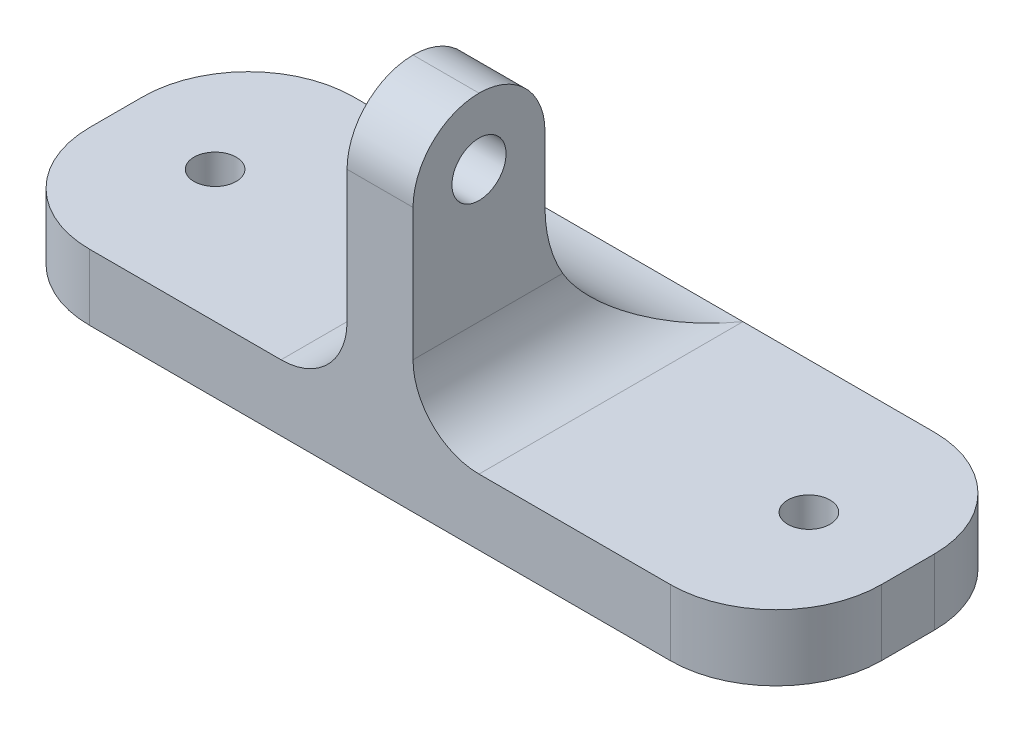
ISO-10303-21;
HEADER;
FILE_DESCRIPTION(('STEP AP214'),'2;1');
FILE_NAME('part.step','',(''),(''),'','','');
FILE_SCHEMA(('AUTOMOTIVE_DESIGN { 1 0 10303 214 1 1 1 1 }'));
ENDSEC;
DATA;
#1=APPLICATION_CONTEXT('core data for automotive mechanical design processes');
#2=APPLICATION_PROTOCOL_DEFINITION('international standard','automotive_design',2000,#1);
#3=PRODUCT_CONTEXT('',#1,'mechanical');
#4=PRODUCT('Part','Part','',(#3));
#5=PRODUCT_RELATED_PRODUCT_CATEGORY('part','',(#4));
#6=PRODUCT_DEFINITION_FORMATION('','',#4);
#7=PRODUCT_DEFINITION_CONTEXT('part definition',#1,'design');
#8=PRODUCT_DEFINITION('design','',#6,#7);
#9=PRODUCT_DEFINITION_SHAPE('','',#8);
#10=(LENGTH_UNIT() NAMED_UNIT(*) SI_UNIT(.MILLI.,.METRE.));
#11=(NAMED_UNIT(*) PLANE_ANGLE_UNIT() SI_UNIT($,.RADIAN.));
#12=(NAMED_UNIT(*) SI_UNIT($,.STERADIAN.) SOLID_ANGLE_UNIT());
#13=UNCERTAINTY_MEASURE_WITH_UNIT(LENGTH_MEASURE(1.E-05),#10,'distance_accuracy_value','');
#14=(GEOMETRIC_REPRESENTATION_CONTEXT(3) GLOBAL_UNCERTAINTY_ASSIGNED_CONTEXT((#13)) GLOBAL_UNIT_ASSIGNED_CONTEXT((#10,
#11,#12)) REPRESENTATION_CONTEXT('',''));
#15=CARTESIAN_POINT('',(0.,0.,0.));
#16=DIRECTION('',(0.,0.,1.));
#17=DIRECTION('',(1.,0.,0.));
#18=AXIS2_PLACEMENT_3D('',#15,#16,#17);
#19=CARTESIAN_POINT('',(0.,5.,0.));
#20=DIRECTION('',(0.,-1.,0.));
#21=DIRECTION('',(0.,0.,-1.));
#22=AXIS2_PLACEMENT_3D('',#19,#20,#21);
#23=PLANE('',#22);
#24=CARTESIAN_POINT('',(-12.5,5.,0.));
#25=DIRECTION('',(0.,-1.,0.));
#26=DIRECTION('',(0.,0.,-1.));
#27=AXIS2_PLACEMENT_3D('',#24,#25,#26);
#28=CIRCLE('',#27,1.6);
#29=CARTESIAN_POINT('',(-12.5,5.,-1.6));
#30=VERTEX_POINT('',#29);
#31=EDGE_CURVE('E172',#30,#30,#28,.T.);
#32=ORIENTED_EDGE('',*,*,#31,.T.);
#33=EDGE_LOOP('',(#32));
#34=FACE_BOUND('',#33,.T.);
#35=DIRECTION('',(-1.,0.,0.));
#36=VECTOR('',#35,1.);
#37=CARTESIAN_POINT('',(-20.,5.,10.));
#38=LINE('',#37,#36);
#39=CARTESIAN_POINT('',(2.5,5.,10.));
#40=VERTEX_POINT('',#39);
#41=CARTESIAN_POINT('',(-12.,5.,10.));
#42=VERTEX_POINT('',#41);
#43=EDGE_CURVE('E366',#40,#42,#38,.T.);
#44=ORIENTED_EDGE('',*,*,#43,.F.);
#45=DIRECTION('',(0.,0.,1.));
#46=VECTOR('',#45,1.);
#47=CARTESIAN_POINT('',(2.5,5.,-10.));
#48=LINE('',#47,#46);
#49=CARTESIAN_POINT('',(2.5,5.,-10.));
#50=VERTEX_POINT('',#49);
#51=EDGE_CURVE('E249',#40,#50,#48,.F.);
#52=ORIENTED_EDGE('',*,*,#51,.T.);
#53=DIRECTION('',(1.,0.,0.));
#54=VECTOR('',#53,1.);
#55=CARTESIAN_POINT('',(-20.,5.,-10.));
#56=LINE('',#55,#54);
#57=CARTESIAN_POINT('',(-12.,5.,-10.));
#58=VERTEX_POINT('',#57);
#59=EDGE_CURVE('E361',#58,#50,#56,.T.);
#60=ORIENTED_EDGE('',*,*,#59,.F.);
#61=CARTESIAN_POINT('',(-12.,5.,-2.));
#62=DIRECTION('',(0.,-1.,0.));
#63=DIRECTION('',(0.,0.,-1.));
#64=AXIS2_PLACEMENT_3D('',#61,#62,#63);
#65=CIRCLE('',#64,8.);
#66=CARTESIAN_POINT('',(-20.,5.,-2.));
#67=VERTEX_POINT('',#66);
#68=EDGE_CURVE('E200',#58,#67,#65,.F.);
#69=ORIENTED_EDGE('',*,*,#68,.T.);
#70=DIRECTION('',(0.,0.,-1.));
#71=VECTOR('',#70,1.);
#72=CARTESIAN_POINT('',(-20.,5.,10.));
#73=LINE('',#72,#71);
#74=CARTESIAN_POINT('',(-20.,5.,2.));
#75=VERTEX_POINT('',#74);
#76=EDGE_CURVE('E357',#75,#67,#73,.T.);
#77=ORIENTED_EDGE('',*,*,#76,.F.);
#78=CARTESIAN_POINT('',(-12.,5.,2.));
#79=DIRECTION('',(0.,-1.,0.));
#80=DIRECTION('',(0.,0.,-1.));
#81=AXIS2_PLACEMENT_3D('',#78,#79,#80);
#82=CIRCLE('',#81,8.);
#83=EDGE_CURVE('E177',#75,#42,#82,.F.);
#84=ORIENTED_EDGE('',*,*,#83,.T.);
#85=EDGE_LOOP('',(#44,#52,#60,#69,#77,#84));
#86=FACE_BOUND('',#85,.T.);
#87=ADVANCED_FACE('F36',(#34,#86),#23,.F.);
#88=CARTESIAN_POINT('',(32.5,5.,0.));
#89=DIRECTION('',(0.,-1.,0.));
#90=DIRECTION('',(0.,0.,-1.));
#91=AXIS2_PLACEMENT_3D('',#88,#89,#90);
#92=CIRCLE('',#91,1.6);
#93=CARTESIAN_POINT('',(32.5,5.,-1.6));
#94=VERTEX_POINT('',#93);
#95=EDGE_CURVE('E355',#94,#94,#92,.T.);
#96=ORIENTED_EDGE('',*,*,#95,.T.);
#97=EDGE_LOOP('',(#96));
#98=FACE_BOUND('',#97,.T.);
#99=CARTESIAN_POINT('',(17.5,5.,-10.));
#100=VERTEX_POINT('',#99);
#101=CARTESIAN_POINT('',(32.,5.,-10.));
#102=VERTEX_POINT('',#101);
#103=EDGE_CURVE('E359',#100,#102,#56,.T.);
#104=ORIENTED_EDGE('',*,*,#103,.F.);
#105=DIRECTION('',(0.,0.,-1.));
#106=VECTOR('',#105,1.);
#107=CARTESIAN_POINT('',(17.5,5.,10.));
#108=LINE('',#107,#106);
#109=CARTESIAN_POINT('',(17.5,5.,10.));
#110=VERTEX_POINT('',#109);
#111=EDGE_CURVE('E244',#100,#110,#108,.F.);
#112=ORIENTED_EDGE('',*,*,#111,.T.);
#113=CARTESIAN_POINT('',(32.,5.,10.));
#114=VERTEX_POINT('',#113);
#115=EDGE_CURVE('E181',#114,#110,#38,.T.);
#116=ORIENTED_EDGE('',*,*,#115,.F.);
#117=CARTESIAN_POINT('',(32.,5.,2.));
#118=DIRECTION('',(0.,-1.,0.));
#119=DIRECTION('',(0.,0.,-1.));
#120=AXIS2_PLACEMENT_3D('',#117,#118,#119);
#121=CIRCLE('',#120,8.);
#122=CARTESIAN_POINT('',(40.,5.,2.));
#123=VERTEX_POINT('',#122);
#124=EDGE_CURVE('E194',#114,#123,#121,.F.);
#125=ORIENTED_EDGE('',*,*,#124,.T.);
#126=DIRECTION('',(0.,0.,1.));
#127=VECTOR('',#126,1.);
#128=CARTESIAN_POINT('',(40.,5.,10.));
#129=LINE('',#128,#127);
#130=CARTESIAN_POINT('',(40.,5.,-2.));
#131=VERTEX_POINT('',#130);
#132=EDGE_CURVE('E363',#131,#123,#129,.T.);
#133=ORIENTED_EDGE('',*,*,#132,.F.);
#134=CARTESIAN_POINT('',(32.,5.,-2.));
#135=DIRECTION('',(0.,-1.,0.));
#136=DIRECTION('',(0.,0.,-1.));
#137=AXIS2_PLACEMENT_3D('',#134,#135,#136);
#138=CIRCLE('',#137,8.);
#139=EDGE_CURVE('E196',#131,#102,#138,.F.);
#140=ORIENTED_EDGE('',*,*,#139,.T.);
#141=EDGE_LOOP('',(#104,#112,#116,#125,#133,#140));
#142=FACE_BOUND('',#141,.T.);
#143=ADVANCED_FACE('F276',(#98,#142),#23,.F.);
#144=CARTESIAN_POINT('',(0.,0.,10.));
#145=DIRECTION('',(0.,0.,-1.));
#146=DIRECTION('',(-1.,0.,0.));
#147=AXIS2_PLACEMENT_3D('',#144,#145,#146);
#148=PLANE('',#147);
#149=DIRECTION('',(0.,-1.,0.));
#150=VECTOR('',#149,1.);
#151=CARTESIAN_POINT('',(12.5,25.,10.));
#152=LINE('',#151,#150);
#153=CARTESIAN_POINT('',(12.5,20.,10.));
#154=VERTEX_POINT('',#153);
#155=CARTESIAN_POINT('',(12.5,10.,10.));
#156=VERTEX_POINT('',#155);
#157=EDGE_CURVE('E342',#154,#156,#152,.T.);
#158=ORIENTED_EDGE('',*,*,#157,.F.);
#159=DIRECTION('',(1.,0.,0.));
#160=VECTOR('',#159,1.);
#161=CARTESIAN_POINT('',(0.,20.,10.));
#162=LINE('',#161,#160);
#163=CARTESIAN_POINT('',(7.5,20.,10.));
#164=VERTEX_POINT('',#163);
#165=EDGE_CURVE('E228',#154,#164,#162,.F.);
#166=ORIENTED_EDGE('',*,*,#165,.T.);
#167=DIRECTION('',(0.,-1.,0.));
#168=VECTOR('',#167,1.);
#169=CARTESIAN_POINT('',(7.5,25.,10.));
#170=LINE('',#169,#168);
#171=CARTESIAN_POINT('',(7.5,10.,10.));
#172=VERTEX_POINT('',#171);
#173=EDGE_CURVE('E340',#164,#172,#170,.T.);
#174=ORIENTED_EDGE('',*,*,#173,.T.);
#175=CARTESIAN_POINT('',(2.5,10.,10.));
#176=DIRECTION('',(0.,0.,-1.));
#177=DIRECTION('',(-1.,0.,0.));
#178=AXIS2_PLACEMENT_3D('',#175,#176,#177);
#179=CIRCLE('',#178,5.);
#180=EDGE_CURVE('E51',#172,#40,#179,.T.);
#181=ORIENTED_EDGE('',*,*,#180,.T.);
#182=ORIENTED_EDGE('',*,*,#43,.T.);
#183=DIRECTION('',(0.,-1.,0.));
#184=VECTOR('',#183,1.);
#185=CARTESIAN_POINT('',(-12.,0.,10.));
#186=LINE('',#185,#184);
#187=CARTESIAN_POINT('',(-12.,0.,10.));
#188=VERTEX_POINT('',#187);
#189=EDGE_CURVE('E205',#42,#188,#186,.T.);
#190=ORIENTED_EDGE('',*,*,#189,.T.);
#191=DIRECTION('',(1.,0.,0.));
#192=VECTOR('',#191,1.);
#193=CARTESIAN_POINT('',(0.,0.,10.));
#194=LINE('',#193,#192);
#195=CARTESIAN_POINT('',(32.,0.,10.));
#196=VERTEX_POINT('',#195);
#197=EDGE_CURVE('E155',#188,#196,#194,.T.);
#198=ORIENTED_EDGE('',*,*,#197,.T.);
#199=DIRECTION('',(0.,-1.,0.));
#200=VECTOR('',#199,1.);
#201=CARTESIAN_POINT('',(32.,5.,10.));
#202=LINE('',#201,#200);
#203=EDGE_CURVE('E202',#196,#114,#202,.F.);
#204=ORIENTED_EDGE('',*,*,#203,.T.);
#205=ORIENTED_EDGE('',*,*,#115,.T.);
#206=CARTESIAN_POINT('',(17.5,10.,10.));
#207=DIRECTION('',(0.,0.,-1.));
#208=DIRECTION('',(-1.,0.,0.));
#209=AXIS2_PLACEMENT_3D('',#206,#207,#208);
#210=CIRCLE('',#209,5.);
#211=EDGE_CURVE('E259',#110,#156,#210,.T.);
#212=ORIENTED_EDGE('',*,*,#211,.T.);
#213=EDGE_LOOP('',(#158,#166,#174,#181,#182,#190,#198,#204,#205,#212));
#214=FACE_BOUND('',#213,.T.);
#215=ADVANCED_FACE('F282',(#214),#148,.F.);
#216=CARTESIAN_POINT('',(0.,0.,10.));
#217=DIRECTION('',(0.,1.,0.));
#218=DIRECTION('',(0.,0.,1.));
#219=AXIS2_PLACEMENT_3D('',#216,#217,#218);
#220=PLANE('',#219);
#221=CARTESIAN_POINT('',(-12.5,0.,0.));
#222=DIRECTION('',(0.,-1.,0.));
#223=DIRECTION('',(0.,0.,-1.));
#224=AXIS2_PLACEMENT_3D('',#221,#222,#223);
#225=CIRCLE('',#224,1.6);
#226=CARTESIAN_POINT('',(-12.5,0.,-1.6));
#227=VERTEX_POINT('',#226);
#228=EDGE_CURVE('E348',#227,#227,#225,.T.);
#229=ORIENTED_EDGE('',*,*,#228,.F.);
#230=EDGE_LOOP('',(#229));
#231=FACE_BOUND('',#230,.T.);
#232=CARTESIAN_POINT('',(32.5,0.,0.));
#233=DIRECTION('',(0.,-1.,0.));
#234=DIRECTION('',(0.,0.,-1.));
#235=AXIS2_PLACEMENT_3D('',#232,#233,#234);
#236=CIRCLE('',#235,1.6);
#237=CARTESIAN_POINT('',(32.5,0.,-1.6));
#238=VERTEX_POINT('',#237);
#239=EDGE_CURVE('E345',#238,#238,#236,.T.);
#240=ORIENTED_EDGE('',*,*,#239,.F.);
#241=EDGE_LOOP('',(#240));
#242=FACE_BOUND('',#241,.T.);
#243=DIRECTION('',(0.,0.,-1.));
#244=VECTOR('',#243,1.);
#245=CARTESIAN_POINT('',(-20.,0.,10.));
#246=LINE('',#245,#244);
#247=CARTESIAN_POINT('',(-20.,0.,2.));
#248=VERTEX_POINT('',#247);
#249=CARTESIAN_POINT('',(-20.,0.,-2.));
#250=VERTEX_POINT('',#249);
#251=EDGE_CURVE('E153',#248,#250,#246,.T.);
#252=ORIENTED_EDGE('',*,*,#251,.T.);
#253=CARTESIAN_POINT('',(-12.,0.,-2.));
#254=DIRECTION('',(0.,1.,0.));
#255=DIRECTION('',(0.,0.,1.));
#256=AXIS2_PLACEMENT_3D('',#253,#254,#255);
#257=CIRCLE('',#256,8.);
#258=CARTESIAN_POINT('',(-12.,0.,-10.));
#259=VERTEX_POINT('',#258);
#260=EDGE_CURVE('E160',#250,#259,#257,.F.);
#261=ORIENTED_EDGE('',*,*,#260,.T.);
#262=DIRECTION('',(1.,0.,0.));
#263=VECTOR('',#262,1.);
#264=CARTESIAN_POINT('',(-20.,0.,-10.));
#265=LINE('',#264,#263);
#266=CARTESIAN_POINT('',(32.,0.,-10.));
#267=VERTEX_POINT('',#266);
#268=EDGE_CURVE('E171',#259,#267,#265,.T.);
#269=ORIENTED_EDGE('',*,*,#268,.T.);
#270=CARTESIAN_POINT('',(32.,0.,-2.));
#271=DIRECTION('',(0.,1.,0.));
#272=DIRECTION('',(0.,0.,1.));
#273=AXIS2_PLACEMENT_3D('',#270,#271,#272);
#274=CIRCLE('',#273,8.);
#275=CARTESIAN_POINT('',(40.,0.,-2.));
#276=VERTEX_POINT('',#275);
#277=EDGE_CURVE('E161',#267,#276,#274,.F.);
#278=ORIENTED_EDGE('',*,*,#277,.T.);
#279=DIRECTION('',(0.,0.,1.));
#280=VECTOR('',#279,1.);
#281=CARTESIAN_POINT('',(40.,0.,10.));
#282=LINE('',#281,#280);
#283=CARTESIAN_POINT('',(40.,0.,2.));
#284=VERTEX_POINT('',#283);
#285=EDGE_CURVE('E360',#276,#284,#282,.T.);
#286=ORIENTED_EDGE('',*,*,#285,.T.);
#287=CARTESIAN_POINT('',(32.,0.,2.));
#288=DIRECTION('',(0.,1.,0.));
#289=DIRECTION('',(0.,0.,1.));
#290=AXIS2_PLACEMENT_3D('',#287,#288,#289);
#291=CIRCLE('',#290,8.);
#292=EDGE_CURVE('E179',#284,#196,#291,.F.);
#293=ORIENTED_EDGE('',*,*,#292,.T.);
#294=ORIENTED_EDGE('',*,*,#197,.F.);
#295=CARTESIAN_POINT('',(-12.,0.,2.));
#296=DIRECTION('',(0.,1.,0.));
#297=DIRECTION('',(0.,0.,1.));
#298=AXIS2_PLACEMENT_3D('',#295,#296,#297);
#299=CIRCLE('',#298,8.);
#300=EDGE_CURVE('E150',#188,#248,#299,.F.);
#301=ORIENTED_EDGE('',*,*,#300,.T.);
#302=EDGE_LOOP('',(#252,#261,#269,#278,#286,#293,#294,#301));
#303=FACE_BOUND('',#302,.T.);
#304=ADVANCED_FACE('F152',(#231,#242,#303),#220,.F.);
#305=CARTESIAN_POINT('',(-20.,5.,10.));
#306=DIRECTION('',(-1.,0.,0.));
#307=DIRECTION('',(0.,0.,1.));
#308=AXIS2_PLACEMENT_3D('',#305,#306,#307);
#309=PLANE('',#308);
#310=ORIENTED_EDGE('',*,*,#76,.T.);
#311=DIRECTION('',(0.,-1.,0.));
#312=VECTOR('',#311,1.);
#313=CARTESIAN_POINT('',(-20.,5.,-2.));
#314=LINE('',#313,#312);
#315=EDGE_CURVE('E170',#67,#250,#314,.T.);
#316=ORIENTED_EDGE('',*,*,#315,.T.);
#317=ORIENTED_EDGE('',*,*,#251,.F.);
#318=DIRECTION('',(0.,-1.,0.));
#319=VECTOR('',#318,1.);
#320=CARTESIAN_POINT('',(-20.,5.,2.));
#321=LINE('',#320,#319);
#322=EDGE_CURVE('E167',#248,#75,#321,.F.);
#323=ORIENTED_EDGE('',*,*,#322,.T.);
#324=EDGE_LOOP('',(#310,#316,#317,#323));
#325=FACE_BOUND('',#324,.T.);
#326=ADVANCED_FACE('F166',(#325),#309,.T.);
#327=CARTESIAN_POINT('',(40.,5.,10.));
#328=DIRECTION('',(1.,0.,0.));
#329=DIRECTION('',(0.,0.,-1.));
#330=AXIS2_PLACEMENT_3D('',#327,#328,#329);
#331=PLANE('',#330);
#332=ORIENTED_EDGE('',*,*,#285,.F.);
#333=DIRECTION('',(0.,-1.,0.));
#334=VECTOR('',#333,1.);
#335=CARTESIAN_POINT('',(40.,5.,-2.));
#336=LINE('',#335,#334);
#337=EDGE_CURVE('E210',#276,#131,#336,.F.);
#338=ORIENTED_EDGE('',*,*,#337,.T.);
#339=ORIENTED_EDGE('',*,*,#132,.T.);
#340=DIRECTION('',(0.,-1.,0.));
#341=VECTOR('',#340,1.);
#342=CARTESIAN_POINT('',(40.,0.,2.));
#343=LINE('',#342,#341);
#344=EDGE_CURVE('E207',#123,#284,#343,.T.);
#345=ORIENTED_EDGE('',*,*,#344,.T.);
#346=EDGE_LOOP('',(#332,#338,#339,#345));
#347=FACE_BOUND('',#346,.T.);
#348=ADVANCED_FACE('F290',(#347),#331,.T.);
#349=CARTESIAN_POINT('',(-20.,5.,-10.));
#350=DIRECTION('',(0.,0.,-1.));
#351=DIRECTION('',(-1.,0.,0.));
#352=AXIS2_PLACEMENT_3D('',#349,#350,#351);
#353=PLANE('',#352);
#354=ORIENTED_EDGE('',*,*,#268,.F.);
#355=DIRECTION('',(0.,-1.,0.));
#356=VECTOR('',#355,1.);
#357=CARTESIAN_POINT('',(-12.,5.,-10.));
#358=LINE('',#357,#356);
#359=EDGE_CURVE('E192',#259,#58,#358,.F.);
#360=ORIENTED_EDGE('',*,*,#359,.T.);
#361=ORIENTED_EDGE('',*,*,#59,.T.);
#362=EDGE_CURVE('E58',#50,#100,#56,.T.);
#363=ORIENTED_EDGE('',*,*,#362,.T.);
#364=ORIENTED_EDGE('',*,*,#103,.T.);
#365=DIRECTION('',(0.,-1.,0.));
#366=VECTOR('',#365,1.);
#367=CARTESIAN_POINT('',(32.,5.,-10.));
#368=LINE('',#367,#366);
#369=EDGE_CURVE('E189',#102,#267,#368,.T.);
#370=ORIENTED_EDGE('',*,*,#369,.T.);
#371=EDGE_LOOP('',(#354,#360,#361,#363,#364,#370));
#372=FACE_BOUND('',#371,.T.);
#373=ADVANCED_FACE('F293',(#372),#353,.T.);
#374=CARTESIAN_POINT('',(32.5,21.,0.));
#375=DIRECTION('',(0.,-1.,0.));
#376=DIRECTION('',(0.,0.,-1.));
#377=AXIS2_PLACEMENT_3D('',#374,#375,#376);
#378=CYLINDRICAL_SURFACE('',#377,1.6);
#379=ORIENTED_EDGE('',*,*,#239,.T.);
#380=EDGE_LOOP('',(#379));
#381=FACE_BOUND('',#380,.T.);
#382=ORIENTED_EDGE('',*,*,#95,.F.);
#383=EDGE_LOOP('',(#382));
#384=FACE_BOUND('',#383,.T.);
#385=ADVANCED_FACE('F288',(#381,#384),#378,.F.);
#386=CARTESIAN_POINT('',(-12.5,21.,0.));
#387=DIRECTION('',(0.,-1.,0.));
#388=DIRECTION('',(0.,0.,-1.));
#389=AXIS2_PLACEMENT_3D('',#386,#387,#388);
#390=CYLINDRICAL_SURFACE('',#389,1.6);
#391=ORIENTED_EDGE('',*,*,#228,.T.);
#392=EDGE_LOOP('',(#391));
#393=FACE_BOUND('',#392,.T.);
#394=ORIENTED_EDGE('',*,*,#31,.F.);
#395=EDGE_LOOP('',(#394));
#396=FACE_BOUND('',#395,.T.);
#397=ADVANCED_FACE('F308',(#393,#396),#390,.F.);
#398=CARTESIAN_POINT('',(-12.,5.,-2.));
#399=DIRECTION('',(0.,-1.,0.));
#400=DIRECTION('',(0.,0.,-1.));
#401=AXIS2_PLACEMENT_3D('',#398,#399,#400);
#402=CYLINDRICAL_SURFACE('',#401,8.);
#403=ORIENTED_EDGE('',*,*,#68,.F.);
#404=ORIENTED_EDGE('',*,*,#359,.F.);
#405=ORIENTED_EDGE('',*,*,#260,.F.);
#406=ORIENTED_EDGE('',*,*,#315,.F.);
#407=EDGE_LOOP('',(#403,#404,#405,#406));
#408=FACE_BOUND('',#407,.T.);
#409=ADVANCED_FACE('F305',(#408),#402,.T.);
#410=CARTESIAN_POINT('',(-12.,0.,2.));
#411=DIRECTION('',(0.,1.,0.));
#412=DIRECTION('',(0.,0.,1.));
#413=AXIS2_PLACEMENT_3D('',#410,#411,#412);
#414=CYLINDRICAL_SURFACE('',#413,8.);
#415=ORIENTED_EDGE('',*,*,#83,.F.);
#416=ORIENTED_EDGE('',*,*,#322,.F.);
#417=ORIENTED_EDGE('',*,*,#300,.F.);
#418=ORIENTED_EDGE('',*,*,#189,.F.);
#419=EDGE_LOOP('',(#415,#416,#417,#418));
#420=FACE_BOUND('',#419,.T.);
#421=ADVANCED_FACE('F175',(#420),#414,.T.);
#422=CARTESIAN_POINT('',(32.,5.,-2.));
#423=DIRECTION('',(0.,-1.,0.));
#424=DIRECTION('',(0.,0.,-1.));
#425=AXIS2_PLACEMENT_3D('',#422,#423,#424);
#426=CYLINDRICAL_SURFACE('',#425,8.);
#427=ORIENTED_EDGE('',*,*,#139,.F.);
#428=ORIENTED_EDGE('',*,*,#337,.F.);
#429=ORIENTED_EDGE('',*,*,#277,.F.);
#430=ORIENTED_EDGE('',*,*,#369,.F.);
#431=EDGE_LOOP('',(#427,#428,#429,#430));
#432=FACE_BOUND('',#431,.T.);
#433=ADVANCED_FACE('F312',(#432),#426,.T.);
#434=CARTESIAN_POINT('',(32.,5.,2.));
#435=DIRECTION('',(0.,1.,0.));
#436=DIRECTION('',(0.,0.,1.));
#437=AXIS2_PLACEMENT_3D('',#434,#435,#436);
#438=CYLINDRICAL_SURFACE('',#437,8.);
#439=ORIENTED_EDGE('',*,*,#124,.F.);
#440=ORIENTED_EDGE('',*,*,#203,.F.);
#441=ORIENTED_EDGE('',*,*,#292,.F.);
#442=ORIENTED_EDGE('',*,*,#344,.F.);
#443=EDGE_LOOP('',(#439,#440,#441,#442));
#444=FACE_BOUND('',#443,.T.);
#445=ADVANCED_FACE('F315',(#444),#438,.T.);
#446=CARTESIAN_POINT('',(7.5,25.,10.));
#447=DIRECTION('',(1.,0.,0.));
#448=DIRECTION('',(0.,0.,-1.));
#449=AXIS2_PLACEMENT_3D('',#446,#447,#448);
#450=PLANE('',#449);
#451=CARTESIAN_POINT('',(7.5,20.,5.));
#452=DIRECTION('',(-1.,0.,0.));
#453=DIRECTION('',(0.,0.,1.));
#454=AXIS2_PLACEMENT_3D('',#451,#452,#453);
#455=CIRCLE('',#454,2.05);
#456=CARTESIAN_POINT('',(7.5,20.,7.05));
#457=VERTEX_POINT('',#456);
#458=EDGE_CURVE('E217',#457,#457,#455,.T.);
#459=ORIENTED_EDGE('',*,*,#458,.F.);
#460=EDGE_LOOP('',(#459));
#461=FACE_BOUND('',#460,.T.);
#462=CARTESIAN_POINT('',(7.5,15.,-10.));
#463=DIRECTION('',(1.,0.,0.));
#464=DIRECTION('',(0.,0.,-1.));
#465=AXIS2_PLACEMENT_3D('',#462,#463,#464);
#466=CIRCLE('',#465,10.);
#467=CARTESIAN_POINT('',(7.5,15.,0.));
#468=VERTEX_POINT('',#467);
#469=CARTESIAN_POINT('',(7.5,10.,-1.33974596215561));
#470=VERTEX_POINT('',#469);
#471=EDGE_CURVE('E236',#468,#470,#466,.T.);
#472=ORIENTED_EDGE('',*,*,#471,.T.);
#473=DIRECTION('',(0.,0.,1.));
#474=VECTOR('',#473,1.);
#475=CARTESIAN_POINT('',(7.5,10.,10.));
#476=LINE('',#475,#474);
#477=EDGE_CURVE('E246',#470,#172,#476,.T.);
#478=ORIENTED_EDGE('',*,*,#477,.T.);
#479=ORIENTED_EDGE('',*,*,#173,.F.);
#480=CARTESIAN_POINT('',(7.5,20.,5.));
#481=DIRECTION('',(1.,0.,0.));
#482=DIRECTION('',(0.,0.,-1.));
#483=AXIS2_PLACEMENT_3D('',#480,#481,#482);
#484=CIRCLE('',#483,5.);
#485=CARTESIAN_POINT('',(7.5,25.,5.));
#486=VERTEX_POINT('',#485);
#487=EDGE_CURVE('E212',#164,#486,#484,.F.);
#488=ORIENTED_EDGE('',*,*,#487,.T.);
#489=CARTESIAN_POINT('',(7.5,20.,5.));
#490=DIRECTION('',(1.,0.,0.));
#491=DIRECTION('',(0.,0.,-1.));
#492=AXIS2_PLACEMENT_3D('',#489,#490,#491);
#493=CIRCLE('',#492,5.);
#494=CARTESIAN_POINT('',(7.5,20.,0.));
#495=VERTEX_POINT('',#494);
#496=EDGE_CURVE('E219',#486,#495,#493,.F.);
#497=ORIENTED_EDGE('',*,*,#496,.T.);
#498=DIRECTION('',(0.,-1.,0.));
#499=VECTOR('',#498,1.);
#500=CARTESIAN_POINT('',(7.5,25.,0.));
#501=LINE('',#500,#499);
#502=EDGE_CURVE('E216',#495,#468,#501,.T.);
#503=ORIENTED_EDGE('',*,*,#502,.T.);
#504=EDGE_LOOP('',(#472,#478,#479,#488,#497,#503));
#505=FACE_BOUND('',#504,.T.);
#506=ADVANCED_FACE('F319',(#461,#505),#450,.F.);
#507=CARTESIAN_POINT('',(12.5,25.,10.));
#508=DIRECTION('',(-1.,0.,0.));
#509=DIRECTION('',(0.,0.,1.));
#510=AXIS2_PLACEMENT_3D('',#507,#508,#509);
#511=PLANE('',#510);
#512=CARTESIAN_POINT('',(12.5,20.,5.));
#513=DIRECTION('',(-1.,0.,0.));
#514=DIRECTION('',(0.,0.,1.));
#515=AXIS2_PLACEMENT_3D('',#512,#513,#514);
#516=CIRCLE('',#515,2.05);
#517=CARTESIAN_POINT('',(12.5,20.,7.05));
#518=VERTEX_POINT('',#517);
#519=EDGE_CURVE('E213',#518,#518,#516,.T.);
#520=ORIENTED_EDGE('',*,*,#519,.T.);
#521=EDGE_LOOP('',(#520));
#522=FACE_BOUND('',#521,.T.);
#523=ORIENTED_EDGE('',*,*,#157,.T.);
#524=DIRECTION('',(0.,0.,-1.));
#525=VECTOR('',#524,1.);
#526=CARTESIAN_POINT('',(12.5,10.,-10.));
#527=LINE('',#526,#525);
#528=CARTESIAN_POINT('',(12.5,10.,-1.33974596215561));
#529=VERTEX_POINT('',#528);
#530=EDGE_CURVE('E241',#156,#529,#527,.T.);
#531=ORIENTED_EDGE('',*,*,#530,.T.);
#532=CARTESIAN_POINT('',(12.5,15.,-10.));
#533=DIRECTION('',(-1.,0.,0.));
#534=DIRECTION('',(0.,0.,1.));
#535=AXIS2_PLACEMENT_3D('',#532,#533,#534);
#536=CIRCLE('',#535,10.);
#537=CARTESIAN_POINT('',(12.5,15.,0.));
#538=VERTEX_POINT('',#537);
#539=EDGE_CURVE('E239',#529,#538,#536,.T.);
#540=ORIENTED_EDGE('',*,*,#539,.T.);
#541=DIRECTION('',(0.,-1.,0.));
#542=VECTOR('',#541,1.);
#543=CARTESIAN_POINT('',(12.5,25.,0.));
#544=LINE('',#543,#542);
#545=CARTESIAN_POINT('',(12.5,20.,0.));
#546=VERTEX_POINT('',#545);
#547=EDGE_CURVE('E350',#546,#538,#544,.T.);
#548=ORIENTED_EDGE('',*,*,#547,.F.);
#549=CARTESIAN_POINT('',(12.5,20.,5.));
#550=DIRECTION('',(-1.,0.,0.));
#551=DIRECTION('',(0.,0.,1.));
#552=AXIS2_PLACEMENT_3D('',#549,#550,#551);
#553=CIRCLE('',#552,5.);
#554=CARTESIAN_POINT('',(12.5,25.,5.));
#555=VERTEX_POINT('',#554);
#556=EDGE_CURVE('E226',#546,#555,#553,.F.);
#557=ORIENTED_EDGE('',*,*,#556,.T.);
#558=CARTESIAN_POINT('',(12.5,20.,5.));
#559=DIRECTION('',(-1.,0.,0.));
#560=DIRECTION('',(0.,0.,1.));
#561=AXIS2_PLACEMENT_3D('',#558,#559,#560);
#562=CIRCLE('',#561,5.);
#563=EDGE_CURVE('E224',#555,#154,#562,.F.);
#564=ORIENTED_EDGE('',*,*,#563,.T.);
#565=EDGE_LOOP('',(#523,#531,#540,#548,#557,#564));
#566=FACE_BOUND('',#565,.T.);
#567=ADVANCED_FACE('F385',(#522,#566),#511,.F.);
#568=CARTESIAN_POINT('',(7.5,25.,0.));
#569=DIRECTION('',(0.,0.,1.));
#570=DIRECTION('',(1.,0.,0.));
#571=AXIS2_PLACEMENT_3D('',#568,#569,#570);
#572=PLANE('',#571);
#573=ORIENTED_EDGE('',*,*,#547,.T.);
#574=DIRECTION('',(-1.,0.,0.));
#575=VECTOR('',#574,1.);
#576=CARTESIAN_POINT('',(7.5,15.,0.));
#577=LINE('',#576,#575);
#578=EDGE_CURVE('E230',#538,#468,#577,.T.);
#579=ORIENTED_EDGE('',*,*,#578,.T.);
#580=ORIENTED_EDGE('',*,*,#502,.F.);
#581=DIRECTION('',(-1.,0.,0.));
#582=VECTOR('',#581,1.);
#583=CARTESIAN_POINT('',(7.5,20.,0.));
#584=LINE('',#583,#582);
#585=EDGE_CURVE('E221',#495,#546,#584,.F.);
#586=ORIENTED_EDGE('',*,*,#585,.T.);
#587=EDGE_LOOP('',(#573,#579,#580,#586));
#588=FACE_BOUND('',#587,.T.);
#589=ADVANCED_FACE('F330',(#588),#572,.F.);
#590=CARTESIAN_POINT('',(27.5,20.,5.));
#591=DIRECTION('',(-1.,0.,0.));
#592=DIRECTION('',(0.,0.,1.));
#593=AXIS2_PLACEMENT_3D('',#590,#591,#592);
#594=CYLINDRICAL_SURFACE('',#593,2.05);
#595=ORIENTED_EDGE('',*,*,#458,.T.);
#596=EDGE_LOOP('',(#595));
#597=FACE_BOUND('',#596,.T.);
#598=ORIENTED_EDGE('',*,*,#519,.F.);
#599=EDGE_LOOP('',(#598));
#600=FACE_BOUND('',#599,.T.);
#601=ADVANCED_FACE('F325',(#597,#600),#594,.F.);
#602=CARTESIAN_POINT('',(0.,20.,5.));
#603=DIRECTION('',(1.,0.,0.));
#604=DIRECTION('',(0.,0.,-1.));
#605=AXIS2_PLACEMENT_3D('',#602,#603,#604);
#606=CYLINDRICAL_SURFACE('',#605,5.);
#607=ORIENTED_EDGE('',*,*,#165,.F.);
#608=ORIENTED_EDGE('',*,*,#563,.F.);
#609=DIRECTION('',(1.,0.,0.));
#610=VECTOR('',#609,1.);
#611=CARTESIAN_POINT('',(0.,25.,5.));
#612=LINE('',#611,#610);
#613=EDGE_CURVE('E231',#486,#555,#612,.T.);
#614=ORIENTED_EDGE('',*,*,#613,.F.);
#615=ORIENTED_EDGE('',*,*,#487,.F.);
#616=EDGE_LOOP('',(#607,#608,#614,#615));
#617=FACE_BOUND('',#616,.T.);
#618=ADVANCED_FACE('F322',(#617),#606,.T.);
#619=CARTESIAN_POINT('',(0.,20.,5.));
#620=DIRECTION('',(-1.,0.,0.));
#621=DIRECTION('',(0.,0.,1.));
#622=AXIS2_PLACEMENT_3D('',#619,#620,#621);
#623=CYLINDRICAL_SURFACE('',#622,5.);
#624=ORIENTED_EDGE('',*,*,#556,.F.);
#625=ORIENTED_EDGE('',*,*,#585,.F.);
#626=ORIENTED_EDGE('',*,*,#496,.F.);
#627=ORIENTED_EDGE('',*,*,#613,.T.);
#628=EDGE_LOOP('',(#624,#625,#626,#627));
#629=FACE_BOUND('',#628,.T.);
#630=ADVANCED_FACE('F272',(#629),#623,.T.);
#631=CARTESIAN_POINT('',(7.5,15.,-10.));
#632=DIRECTION('',(1.,0.,0.));
#633=DIRECTION('',(0.,0.,-1.));
#634=AXIS2_PLACEMENT_3D('',#631,#632,#633);
#635=CYLINDRICAL_SURFACE('',#634,10.);
#636=ORIENTED_EDGE('',*,*,#539,.F.);
#637=CARTESIAN_POINT('',(12.5,10.,-1.33974596215561));
#638=CARTESIAN_POINT('',(12.5000002829008,9.90639019601523,-1.39378799254219));
#639=CARTESIAN_POINT('',(12.5026288745514,9.81368873555088,-1.44933704504793));
#640=CARTESIAN_POINT('',(12.512837252933,9.63035861397015,-1.56325986767858));
#641=CARTESIAN_POINT('',(12.5204153066888,9.53972923883738,-1.62163264250082));
#642=CARTESIAN_POINT('',(12.5500643550123,9.27172755961135,-1.80043301912901));
#643=CARTESIAN_POINT('',(12.5790536521328,9.09772503906838,-1.92484145612798));
#644=CARTESIAN_POINT('',(12.6525618576713,8.76249250166889,-2.18095556524418));
#645=CARTESIAN_POINT('',(12.6968699815399,8.60112383363213,-2.31254275449181));
#646=CARTESIAN_POINT('',(12.7989271645851,8.28919320122696,-2.58327859913516));
#647=CARTESIAN_POINT('',(12.856686112509,8.13863929470146,-2.72243275962745));
#648=CARTESIAN_POINT('',(12.9957352209033,7.82122300336085,-3.03411171534371));
#649=CARTESIAN_POINT('',(13.0794113795358,7.65670130631513,-3.20795141312214));
#650=CARTESIAN_POINT('',(13.2601137242358,7.34368125107363,-3.56285826481492));
#651=CARTESIAN_POINT('',(13.3571401959647,7.19518323586352,-3.74392557332212));
#652=CARTESIAN_POINT('',(13.5627415552706,6.9131540087972,-4.11296705846485));
#653=CARTESIAN_POINT('',(13.6713781898031,6.77971145646668,-4.30097429057304));
#654=CARTESIAN_POINT('',(13.8977617022044,6.52832933427746,-4.68183469868985));
#655=CARTESIAN_POINT('',(14.0155112343589,6.41039430844974,-4.87468927544143));
#656=CARTESIAN_POINT('',(14.3076692204953,6.14484136774468,-5.3432640618171));
#657=CARTESIAN_POINT('',(14.4857031510398,6.00455896048708,-5.62089763672597));
#658=CARTESIAN_POINT('',(14.8527000735921,5.75248513977304,-6.18187355818814));
#659=CARTESIAN_POINT('',(15.0416679240638,5.64070651305991,-6.465218405523));
#660=CARTESIAN_POINT('',(15.4272097213761,5.44475870753717,-7.0355220744024));
#661=CARTESIAN_POINT('',(15.6237717834615,5.36054819778619,-7.3224748099069));
#662=CARTESIAN_POINT('',(16.022227405755,5.2186939466712,-7.89901450822327));
#663=CARTESIAN_POINT('',(16.2241186307509,5.1610387667105,-8.18860028194756));
#664=CARTESIAN_POINT('',(16.602915797406,5.07786205450143,-8.7290918378797));
#665=CARTESIAN_POINT('',(16.7794008009875,5.04899145046863,-8.9797882487079));
#666=CARTESIAN_POINT('',(17.1334209377063,5.01028204279475,-9.4815673839886));
#667=CARTESIAN_POINT('',(17.3109547658919,5.00042318429848,-9.73264942144162));
#668=CARTESIAN_POINT('',(17.4923020170789,5.0000044457948,-9.9891134078933));
#669=CARTESIAN_POINT('',(17.4961510202372,5.00000000147087,-9.99455672035067));
#670=CARTESIAN_POINT('',(17.5,5.,-10.));
#671=B_SPLINE_CURVE_WITH_KNOTS('',3,(#637,#638,#639,#640,#641,#642,#643,#644,#645,#646,#647,
#648,#649,#650,#651,#652,#653,#654,#655,#656,#657,#658,#659,#660,#661,#662,#663,#664,#665,#666,
#667,#668,#669,#670),.UNSPECIFIED.,.F.,.F.,(4,2,2,2,2,2,2,2,2,2,2,2,2,2,2,2,4),(0.,
0.32416450169912,0.648215563169906,1.29453690515204,1.93229735394214,2.57052815854178,
3.33008992767274,4.08966795194087,4.85350822338376,5.61757181965429,6.69122947966721,
7.76536793656886,8.83788855857108,9.90994676377595,10.8332249647611,11.7555286965104,
11.7755287009549),.UNSPECIFIED.);
#672=EDGE_CURVE('E252',#529,#100,#671,.T.);
#673=ORIENTED_EDGE('',*,*,#672,.T.);
#674=ORIENTED_EDGE('',*,*,#362,.F.);
#675=CARTESIAN_POINT('',(7.5,10.,-1.33974596215561));
#676=CARTESIAN_POINT('',(7.49999971709922,9.9063901960152,-1.39378799254221));
#677=CARTESIAN_POINT('',(7.49737112544864,9.81368873555083,-1.44933704504796));
#678=CARTESIAN_POINT('',(7.48716274706699,9.63035861397005,-1.56325986767865));
#679=CARTESIAN_POINT('',(7.47958469331116,9.53972923883726,-1.6216326425009));
#680=CARTESIAN_POINT('',(7.44993564498767,9.27172755961116,-1.80043301912914));
#681=CARTESIAN_POINT('',(7.42094634786713,9.09772503906814,-1.92484145612816));
#682=CARTESIAN_POINT('',(7.34743814232862,8.76249250166867,-2.18095556524436));
#683=CARTESIAN_POINT('',(7.30313001846007,8.60112383363195,-2.31254275449196));
#684=CARTESIAN_POINT('',(7.20107283541482,8.28919320122688,-2.58327859913523));
#685=CARTESIAN_POINT('',(7.14331388749095,8.13863929470142,-2.72243275962749));
#686=CARTESIAN_POINT('',(7.0042647790967,7.82122300336087,-3.03411171534369));
#687=CARTESIAN_POINT('',(6.92058862046427,7.65670130631517,-3.2079514131221));
#688=CARTESIAN_POINT('',(6.73988627576425,7.34368125107371,-3.56285826481483));
#689=CARTESIAN_POINT('',(6.64285980403533,7.19518323586362,-3.743925573322));
#690=CARTESIAN_POINT('',(6.43725844472947,6.91315400879729,-4.11296705846473));
#691=CARTESIAN_POINT('',(6.32862181019699,6.77971145646675,-4.30097429057295));
#692=CARTESIAN_POINT('',(6.1022382977956,6.52832933427749,-4.6818346986898));
#693=CARTESIAN_POINT('',(5.98448876564109,6.41039430844976,-4.8746892754414));
#694=CARTESIAN_POINT('',(5.69233077950464,6.14484136774465,-5.34326406181713));
#695=CARTESIAN_POINT('',(5.51429684896018,6.00455896048704,-5.62089763672605));
#696=CARTESIAN_POINT('',(5.14729992640777,5.75248513977298,-6.18187355818825));
#697=CARTESIAN_POINT('',(4.95833207593605,5.64070651305985,-6.46521840552311));
#698=CARTESIAN_POINT('',(4.57279027862392,5.44475870753713,-7.0355220744026));
#699=CARTESIAN_POINT('',(4.37622821653868,5.36054819778616,-7.32247480990722));
#700=CARTESIAN_POINT('',(3.97777259424472,5.21869394667119,-7.89901450822311));
#701=CARTESIAN_POINT('',(3.77588136924801,5.1610387667105,-8.18860028194681));
#702=CARTESIAN_POINT('',(3.39708420259493,5.07786205450143,-8.72909183788036));
#703=CARTESIAN_POINT('',(3.22059919901578,5.04899145046864,-8.97978824871021));
#704=CARTESIAN_POINT('',(2.86657906229043,5.01028204279475,-9.4815673839863));
#705=CARTESIAN_POINT('',(2.689045234096,5.00042318429847,-9.73264942143306));
#706=CARTESIAN_POINT('',(2.50769798292056,5.0000044457948,-9.98911340789293));
#707=CARTESIAN_POINT('',(2.50384897976251,5.00000000147087,-9.99455672035048));
#708=CARTESIAN_POINT('',(2.5,5.,-10.));
#709=B_SPLINE_CURVE_WITH_KNOTS('',3,(#675,#676,#677,#678,#679,#680,#681,#682,#683,#684,#685,
#686,#687,#688,#689,#690,#691,#692,#693,#694,#695,#696,#697,#698,#699,#700,#701,#702,#703,#704,
#705,#706,#707,#708),.UNSPECIFIED.,.F.,.F.,(4,2,2,2,2,2,2,2,2,2,2,2,2,2,2,2,4),(0.,
0.324164501699208,0.648215563170085,1.29453690515239,1.93229735394232,2.57052815854178,
3.33008992767265,4.08966795194067,4.85350822338366,5.61757181965429,6.69122947966734,
7.76536793656909,8.83788855857117,9.90994676377595,10.8332249647611,11.7555286965104,
11.7755287009549),.UNSPECIFIED.);
#710=EDGE_CURVE('E11',#50,#470,#709,.F.);
#711=ORIENTED_EDGE('',*,*,#710,.T.);
#712=ORIENTED_EDGE('',*,*,#471,.F.);
#713=ORIENTED_EDGE('',*,*,#578,.F.);
#714=EDGE_LOOP('',(#636,#673,#674,#711,#712,#713));
#715=FACE_BOUND('',#714,.T.);
#716=ADVANCED_FACE('F260',(#715),#635,.F.);
#717=CARTESIAN_POINT('',(17.5,10.,10.));
#718=DIRECTION('',(0.,0.,1.));
#719=DIRECTION('',(1.,0.,0.));
#720=AXIS2_PLACEMENT_3D('',#717,#718,#719);
#721=CYLINDRICAL_SURFACE('',#720,5.);
#722=ORIENTED_EDGE('',*,*,#211,.F.);
#723=ORIENTED_EDGE('',*,*,#111,.F.);
#724=ORIENTED_EDGE('',*,*,#672,.F.);
#725=ORIENTED_EDGE('',*,*,#530,.F.);
#726=EDGE_LOOP('',(#722,#723,#724,#725));
#727=FACE_BOUND('',#726,.T.);
#728=ADVANCED_FACE('F263',(#727),#721,.F.);
#729=CARTESIAN_POINT('',(2.5,10.,10.));
#730=DIRECTION('',(0.,0.,-1.));
#731=DIRECTION('',(-1.,0.,0.));
#732=AXIS2_PLACEMENT_3D('',#729,#730,#731);
#733=CYLINDRICAL_SURFACE('',#732,5.);
#734=ORIENTED_EDGE('',*,*,#710,.F.);
#735=ORIENTED_EDGE('',*,*,#51,.F.);
#736=ORIENTED_EDGE('',*,*,#180,.F.);
#737=ORIENTED_EDGE('',*,*,#477,.F.);
#738=EDGE_LOOP('',(#734,#735,#736,#737));
#739=FACE_BOUND('',#738,.T.);
#740=ADVANCED_FACE('F38',(#739),#733,.F.);
#741=CLOSED_SHELL('',(#87,#143,#215,#304,#326,#348,#373,#385,#397,#409,#421,#433,#445,#506,#567,
#589,#601,#618,#630,#716,#728,#740));
#742=MANIFOLD_SOLID_BREP('B2',#741);
#743=ADVANCED_BREP_SHAPE_REPRESENTATION('',(#18,#742),#14);
#744=SHAPE_DEFINITION_REPRESENTATION(#9,#743);
ENDSEC;
END-ISO-10303-21;
